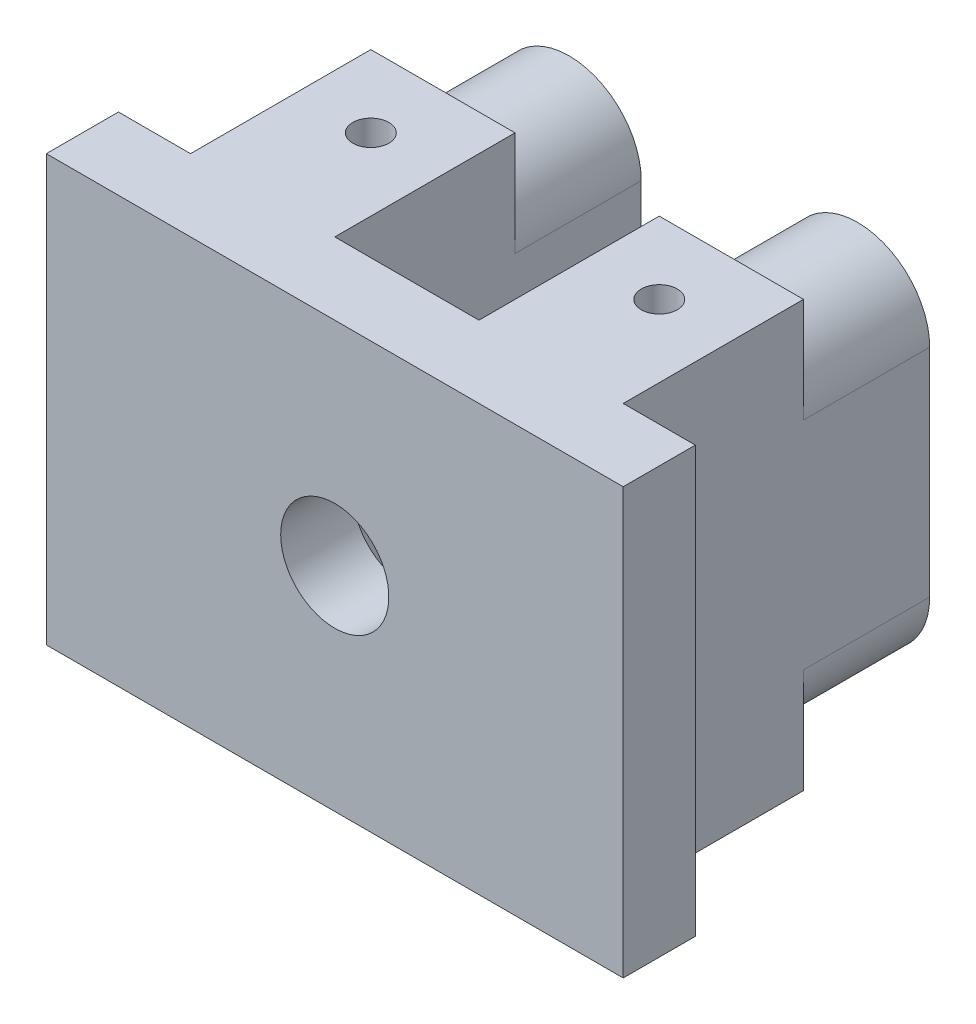
ISO-10303-21;
HEADER;
FILE_DESCRIPTION(('STEP AP214'),'2;1');
FILE_NAME('part.step','',(''),(''),'','','');
FILE_SCHEMA(('AUTOMOTIVE_DESIGN { 1 0 10303 214 1 1 1 1 }'));
ENDSEC;
DATA;
#1=APPLICATION_CONTEXT('core data for automotive mechanical design processes');
#2=APPLICATION_PROTOCOL_DEFINITION('international standard','automotive_design',2000,#1);
#3=PRODUCT_CONTEXT('',#1,'mechanical');
#4=PRODUCT('Part','Part','',(#3));
#5=PRODUCT_RELATED_PRODUCT_CATEGORY('part','',(#4));
#6=PRODUCT_DEFINITION_FORMATION('','',#4);
#7=PRODUCT_DEFINITION_CONTEXT('part definition',#1,'design');
#8=PRODUCT_DEFINITION('design','',#6,#7);
#9=PRODUCT_DEFINITION_SHAPE('','',#8);
#10=(LENGTH_UNIT() NAMED_UNIT(*) SI_UNIT(.MILLI.,.METRE.));
#11=(NAMED_UNIT(*) PLANE_ANGLE_UNIT() SI_UNIT($,.RADIAN.));
#12=(NAMED_UNIT(*) SI_UNIT($,.STERADIAN.) SOLID_ANGLE_UNIT());
#13=UNCERTAINTY_MEASURE_WITH_UNIT(LENGTH_MEASURE(1.E-05),#10,'distance_accuracy_value','');
#14=(GEOMETRIC_REPRESENTATION_CONTEXT(3) GLOBAL_UNCERTAINTY_ASSIGNED_CONTEXT((#13)) GLOBAL_UNIT_ASSIGNED_CONTEXT((#10,
#11,#12)) REPRESENTATION_CONTEXT('',''));
#15=CARTESIAN_POINT('',(0.,0.,0.));
#16=DIRECTION('',(0.,0.,1.));
#17=DIRECTION('',(1.,0.,0.));
#18=AXIS2_PLACEMENT_3D('',#15,#16,#17);
#19=CARTESIAN_POINT('',(6.,11.8,-7.));
#20=DIRECTION('',(0.,0.,1.));
#21=DIRECTION('',(1.,0.,0.));
#22=AXIS2_PLACEMENT_3D('',#19,#20,#21);
#23=PLANE('',#22);
#24=DIRECTION('',(0.,-1.,0.));
#25=VECTOR('',#24,1.);
#26=CARTESIAN_POINT('',(6.,11.8,-7.));
#27=LINE('',#26,#25);
#28=CARTESIAN_POINT('',(6.,11.8,-7.));
#29=VERTEX_POINT('',#28);
#30=CARTESIAN_POINT('',(6.,8.9,-7.));
#31=VERTEX_POINT('',#30);
#32=EDGE_CURVE('E316',#29,#31,#27,.T.);
#33=ORIENTED_EDGE('',*,*,#32,.T.);
#34=CARTESIAN_POINT('',(4.,8.9,-7.));
#35=DIRECTION('',(0.,0.,1.));
#36=DIRECTION('',(1.,0.,0.));
#37=AXIS2_PLACEMENT_3D('',#34,#35,#36);
#38=CIRCLE('',#37,2.);
#39=CARTESIAN_POINT('',(2.,8.9,-7.));
#40=VERTEX_POINT('',#39);
#41=EDGE_CURVE('E209',#31,#40,#38,.T.);
#42=ORIENTED_EDGE('',*,*,#41,.T.);
#43=DIRECTION('',(0.,-1.,0.));
#44=VECTOR('',#43,1.);
#45=CARTESIAN_POINT('',(2.,11.8,-7.));
#46=LINE('',#45,#44);
#47=CARTESIAN_POINT('',(2.,11.8,-7.));
#48=VERTEX_POINT('',#47);
#49=EDGE_CURVE('E174',#48,#40,#46,.T.);
#50=ORIENTED_EDGE('',*,*,#49,.F.);
#51=DIRECTION('',(-1.,0.,0.));
#52=VECTOR('',#51,1.);
#53=CARTESIAN_POINT('',(6.,11.8,-7.));
#54=LINE('',#53,#52);
#55=EDGE_CURVE('E246',#29,#48,#54,.T.);
#56=ORIENTED_EDGE('',*,*,#55,.F.);
#57=EDGE_LOOP('',(#33,#42,#50,#56));
#58=FACE_BOUND('',#57,.T.);
#59=ADVANCED_FACE('F32',(#58),#23,.F.);
#60=CARTESIAN_POINT('',(-2.,11.8,-7.));
#61=DIRECTION('',(0.,0.,1.));
#62=DIRECTION('',(1.,0.,0.));
#63=AXIS2_PLACEMENT_3D('',#60,#61,#62);
#64=PLANE('',#63);
#65=DIRECTION('',(0.,-1.,0.));
#66=VECTOR('',#65,1.);
#67=CARTESIAN_POINT('',(-2.,11.8,-7.));
#68=LINE('',#67,#66);
#69=CARTESIAN_POINT('',(-2.,11.8,-7.));
#70=VERTEX_POINT('',#69);
#71=CARTESIAN_POINT('',(-2.,8.9,-7.));
#72=VERTEX_POINT('',#71);
#73=EDGE_CURVE('E306',#70,#72,#68,.T.);
#74=ORIENTED_EDGE('',*,*,#73,.T.);
#75=CARTESIAN_POINT('',(-4.,8.9,-7.));
#76=DIRECTION('',(0.,0.,1.));
#77=DIRECTION('',(1.,0.,0.));
#78=AXIS2_PLACEMENT_3D('',#75,#76,#77);
#79=CIRCLE('',#78,2.);
#80=CARTESIAN_POINT('',(-6.,8.9,-7.));
#81=VERTEX_POINT('',#80);
#82=EDGE_CURVE('E233',#72,#81,#79,.T.);
#83=ORIENTED_EDGE('',*,*,#82,.T.);
#84=DIRECTION('',(0.,-1.,0.));
#85=VECTOR('',#84,1.);
#86=CARTESIAN_POINT('',(-6.,11.8,-7.));
#87=LINE('',#86,#85);
#88=CARTESIAN_POINT('',(-6.,11.8,-7.));
#89=VERTEX_POINT('',#88);
#90=EDGE_CURVE('E302',#89,#81,#87,.T.);
#91=ORIENTED_EDGE('',*,*,#90,.F.);
#92=DIRECTION('',(-1.,0.,0.));
#93=VECTOR('',#92,1.);
#94=CARTESIAN_POINT('',(-2.,11.8,-7.));
#95=LINE('',#94,#93);
#96=EDGE_CURVE('E254',#70,#89,#95,.T.);
#97=ORIENTED_EDGE('',*,*,#96,.F.);
#98=EDGE_LOOP('',(#74,#83,#91,#97));
#99=FACE_BOUND('',#98,.T.);
#100=ADVANCED_FACE('F387',(#99),#64,.F.);
#101=CARTESIAN_POINT('',(0.,11.8,0.));
#102=DIRECTION('',(0.,0.,-1.));
#103=DIRECTION('',(-1.,0.,0.));
#104=AXIS2_PLACEMENT_3D('',#101,#102,#103);
#105=PLANE('',#104);
#106=CARTESIAN_POINT('',(0.,5.9,0.));
#107=DIRECTION('',(0.,0.,-1.));
#108=DIRECTION('',(-1.,0.,0.));
#109=AXIS2_PLACEMENT_3D('',#106,#107,#108);
#110=CIRCLE('',#109,1.5);
#111=CARTESIAN_POINT('',(-1.5,5.9,0.));
#112=VERTEX_POINT('',#111);
#113=EDGE_CURVE('E434',#112,#112,#110,.T.);
#114=ORIENTED_EDGE('',*,*,#113,.T.);
#115=EDGE_LOOP('',(#114));
#116=FACE_BOUND('',#115,.T.);
#117=DIRECTION('',(1.,0.,0.));
#118=VECTOR('',#117,1.);
#119=CARTESIAN_POINT('',(0.,0.,0.));
#120=LINE('',#119,#118);
#121=CARTESIAN_POINT('',(-8.,0.,0.));
#122=VERTEX_POINT('',#121);
#123=CARTESIAN_POINT('',(8.,0.,0.));
#124=VERTEX_POINT('',#123);
#125=EDGE_CURVE('E236',#122,#124,#120,.T.);
#126=ORIENTED_EDGE('',*,*,#125,.T.);
#127=DIRECTION('',(0.,-1.,0.));
#128=VECTOR('',#127,1.);
#129=CARTESIAN_POINT('',(8.,11.8,0.));
#130=LINE('',#129,#128);
#131=CARTESIAN_POINT('',(8.,11.8,0.));
#132=VERTEX_POINT('',#131);
#133=EDGE_CURVE('E11',#132,#124,#130,.T.);
#134=ORIENTED_EDGE('',*,*,#133,.F.);
#135=DIRECTION('',(1.,0.,0.));
#136=VECTOR('',#135,1.);
#137=CARTESIAN_POINT('',(-8.,11.8,0.));
#138=LINE('',#137,#136);
#139=CARTESIAN_POINT('',(-8.,11.8,0.));
#140=VERTEX_POINT('',#139);
#141=EDGE_CURVE('E237',#140,#132,#138,.T.);
#142=ORIENTED_EDGE('',*,*,#141,.F.);
#143=DIRECTION('',(0.,-1.,0.));
#144=VECTOR('',#143,1.);
#145=CARTESIAN_POINT('',(-8.,11.8,0.));
#146=LINE('',#145,#144);
#147=EDGE_CURVE('E262',#140,#122,#146,.T.);
#148=ORIENTED_EDGE('',*,*,#147,.T.);
#149=EDGE_LOOP('',(#126,#134,#142,#148));
#150=FACE_BOUND('',#149,.T.);
#151=ADVANCED_FACE('F34',(#116,#150),#105,.F.);
#152=CARTESIAN_POINT('',(8.,11.8,0.));
#153=DIRECTION('',(-1.,0.,0.));
#154=DIRECTION('',(0.,0.,1.));
#155=AXIS2_PLACEMENT_3D('',#152,#153,#154);
#156=PLANE('',#155);
#157=DIRECTION('',(0.,0.,-1.));
#158=VECTOR('',#157,1.);
#159=CARTESIAN_POINT('',(8.,0.,0.));
#160=LINE('',#159,#158);
#161=CARTESIAN_POINT('',(8.,0.,-2.));
#162=VERTEX_POINT('',#161);
#163=EDGE_CURVE('E264',#124,#162,#160,.T.);
#164=ORIENTED_EDGE('',*,*,#163,.T.);
#165=DIRECTION('',(0.,-1.,0.));
#166=VECTOR('',#165,1.);
#167=CARTESIAN_POINT('',(8.,11.8,-2.));
#168=LINE('',#167,#166);
#169=CARTESIAN_POINT('',(8.,11.8,-2.));
#170=VERTEX_POINT('',#169);
#171=EDGE_CURVE('E41',#170,#162,#168,.T.);
#172=ORIENTED_EDGE('',*,*,#171,.F.);
#173=DIRECTION('',(0.,0.,-1.));
#174=VECTOR('',#173,1.);
#175=CARTESIAN_POINT('',(8.,11.8,0.));
#176=LINE('',#175,#174);
#177=EDGE_CURVE('E239',#132,#170,#176,.T.);
#178=ORIENTED_EDGE('',*,*,#177,.F.);
#179=ORIENTED_EDGE('',*,*,#133,.T.);
#180=EDGE_LOOP('',(#164,#172,#178,#179));
#181=FACE_BOUND('',#180,.T.);
#182=ADVANCED_FACE('F346',(#181),#156,.F.);
#183=CARTESIAN_POINT('',(8.,11.8,-2.));
#184=DIRECTION('',(0.,0.,1.));
#185=DIRECTION('',(1.,0.,0.));
#186=AXIS2_PLACEMENT_3D('',#183,#184,#185);
#187=PLANE('',#186);
#188=DIRECTION('',(-1.,0.,0.));
#189=VECTOR('',#188,1.);
#190=CARTESIAN_POINT('',(8.,0.,-2.));
#191=LINE('',#190,#189);
#192=CARTESIAN_POINT('',(6.,0.,-2.));
#193=VERTEX_POINT('',#192);
#194=EDGE_CURVE('E266',#162,#193,#191,.T.);
#195=ORIENTED_EDGE('',*,*,#194,.T.);
#196=DIRECTION('',(0.,-1.,0.));
#197=VECTOR('',#196,1.);
#198=CARTESIAN_POINT('',(6.,11.8,-2.));
#199=LINE('',#198,#197);
#200=CARTESIAN_POINT('',(6.,11.8,-2.));
#201=VERTEX_POINT('',#200);
#202=EDGE_CURVE('E319',#201,#193,#199,.T.);
#203=ORIENTED_EDGE('',*,*,#202,.F.);
#204=DIRECTION('',(-1.,0.,0.));
#205=VECTOR('',#204,1.);
#206=CARTESIAN_POINT('',(8.,11.8,-2.));
#207=LINE('',#206,#205);
#208=EDGE_CURVE('E242',#170,#201,#207,.T.);
#209=ORIENTED_EDGE('',*,*,#208,.F.);
#210=ORIENTED_EDGE('',*,*,#171,.T.);
#211=EDGE_LOOP('',(#195,#203,#209,#210));
#212=FACE_BOUND('',#211,.T.);
#213=ADVANCED_FACE('F326',(#212),#187,.F.);
#214=CARTESIAN_POINT('',(6.,11.8,-2.));
#215=DIRECTION('',(-1.,0.,0.));
#216=DIRECTION('',(0.,0.,1.));
#217=AXIS2_PLACEMENT_3D('',#214,#215,#216);
#218=PLANE('',#217);
#219=CARTESIAN_POINT('',(6.,2.9,-7.));
#220=VERTEX_POINT('',#219);
#221=CARTESIAN_POINT('',(6.,0.,-7.));
#222=VERTEX_POINT('',#221);
#223=EDGE_CURVE('E315',#220,#222,#27,.T.);
#224=ORIENTED_EDGE('',*,*,#223,.F.);
#225=DIRECTION('',(0.,0.,1.));
#226=VECTOR('',#225,1.);
#227=CARTESIAN_POINT('',(6.,2.9,-10.5));
#228=LINE('',#227,#226);
#229=CARTESIAN_POINT('',(6.,2.9,-10.5));
#230=VERTEX_POINT('',#229);
#231=EDGE_CURVE('E204',#230,#220,#228,.T.);
#232=ORIENTED_EDGE('',*,*,#231,.F.);
#233=DIRECTION('',(0.,1.,0.));
#234=VECTOR('',#233,1.);
#235=CARTESIAN_POINT('',(6.,8.9,-10.5));
#236=LINE('',#235,#234);
#237=CARTESIAN_POINT('',(6.,8.9,-10.5));
#238=VERTEX_POINT('',#237);
#239=EDGE_CURVE('E178',#230,#238,#236,.T.);
#240=ORIENTED_EDGE('',*,*,#239,.T.);
#241=DIRECTION('',(0.,0.,1.));
#242=VECTOR('',#241,1.);
#243=CARTESIAN_POINT('',(6.,8.9,-10.5));
#244=LINE('',#243,#242);
#245=EDGE_CURVE('E192',#238,#31,#244,.T.);
#246=ORIENTED_EDGE('',*,*,#245,.T.);
#247=ORIENTED_EDGE('',*,*,#32,.F.);
#248=DIRECTION('',(0.,0.,-1.));
#249=VECTOR('',#248,1.);
#250=CARTESIAN_POINT('',(6.,11.8,-2.));
#251=LINE('',#250,#249);
#252=EDGE_CURVE('E244',#201,#29,#251,.T.);
#253=ORIENTED_EDGE('',*,*,#252,.F.);
#254=ORIENTED_EDGE('',*,*,#202,.T.);
#255=DIRECTION('',(0.,0.,-1.));
#256=VECTOR('',#255,1.);
#257=CARTESIAN_POINT('',(6.,0.,-2.));
#258=LINE('',#257,#256);
#259=EDGE_CURVE('E269',#193,#222,#258,.T.);
#260=ORIENTED_EDGE('',*,*,#259,.T.);
#261=EDGE_LOOP('',(#224,#232,#240,#246,#247,#253,#254,#260));
#262=FACE_BOUND('',#261,.T.);
#263=ADVANCED_FACE('F338',(#262),#218,.F.);
#264=CARTESIAN_POINT('',(2.,2.9,-7.));
#265=VERTEX_POINT('',#264);
#266=CARTESIAN_POINT('',(2.,0.,-7.));
#267=VERTEX_POINT('',#266);
#268=EDGE_CURVE('E313',#265,#267,#46,.T.);
#269=ORIENTED_EDGE('',*,*,#268,.F.);
#270=CARTESIAN_POINT('',(4.,2.9,-7.));
#271=DIRECTION('',(0.,0.,1.));
#272=DIRECTION('',(1.,0.,0.));
#273=AXIS2_PLACEMENT_3D('',#270,#271,#272);
#274=CIRCLE('',#273,2.);
#275=EDGE_CURVE('E203',#265,#220,#274,.T.);
#276=ORIENTED_EDGE('',*,*,#275,.T.);
#277=ORIENTED_EDGE('',*,*,#223,.T.);
#278=DIRECTION('',(-1.,0.,0.));
#279=VECTOR('',#278,1.);
#280=CARTESIAN_POINT('',(6.,0.,-7.));
#281=LINE('',#280,#279);
#282=EDGE_CURVE('E272',#222,#267,#281,.T.);
#283=ORIENTED_EDGE('',*,*,#282,.T.);
#284=EDGE_LOOP('',(#269,#276,#277,#283));
#285=FACE_BOUND('',#284,.T.);
#286=ADVANCED_FACE('F379',(#285),#23,.F.);
#287=CARTESIAN_POINT('',(2.,11.8,-7.));
#288=DIRECTION('',(1.,0.,0.));
#289=DIRECTION('',(0.,0.,-1.));
#290=AXIS2_PLACEMENT_3D('',#287,#288,#289);
#291=PLANE('',#290);
#292=ORIENTED_EDGE('',*,*,#49,.T.);
#293=DIRECTION('',(0.,0.,1.));
#294=VECTOR('',#293,1.);
#295=CARTESIAN_POINT('',(2.,8.9,-10.5));
#296=LINE('',#295,#294);
#297=CARTESIAN_POINT('',(2.,8.9,-10.5));
#298=VERTEX_POINT('',#297);
#299=EDGE_CURVE('E168',#298,#40,#296,.T.);
#300=ORIENTED_EDGE('',*,*,#299,.F.);
#301=DIRECTION('',(0.,-1.,0.));
#302=VECTOR('',#301,1.);
#303=CARTESIAN_POINT('',(2.,8.9,-10.5));
#304=LINE('',#303,#302);
#305=CARTESIAN_POINT('',(2.,2.9,-10.5));
#306=VERTEX_POINT('',#305);
#307=EDGE_CURVE('E171',#298,#306,#304,.T.);
#308=ORIENTED_EDGE('',*,*,#307,.T.);
#309=DIRECTION('',(0.,0.,1.));
#310=VECTOR('',#309,1.);
#311=CARTESIAN_POINT('',(2.,2.9,-10.5));
#312=LINE('',#311,#310);
#313=EDGE_CURVE('E48',#306,#265,#312,.T.);
#314=ORIENTED_EDGE('',*,*,#313,.T.);
#315=ORIENTED_EDGE('',*,*,#268,.T.);
#316=DIRECTION('',(0.,0.,1.));
#317=VECTOR('',#316,1.);
#318=CARTESIAN_POINT('',(2.,0.,-7.));
#319=LINE('',#318,#317);
#320=CARTESIAN_POINT('',(2.,0.,-2.));
#321=VERTEX_POINT('',#320);
#322=EDGE_CURVE('E275',#267,#321,#319,.T.);
#323=ORIENTED_EDGE('',*,*,#322,.T.);
#324=DIRECTION('',(0.,-1.,0.));
#325=VECTOR('',#324,1.);
#326=CARTESIAN_POINT('',(2.,11.8,-2.));
#327=LINE('',#326,#325);
#328=CARTESIAN_POINT('',(2.,11.8,-2.));
#329=VERTEX_POINT('',#328);
#330=EDGE_CURVE('E311',#329,#321,#327,.T.);
#331=ORIENTED_EDGE('',*,*,#330,.F.);
#332=DIRECTION('',(0.,0.,1.));
#333=VECTOR('',#332,1.);
#334=CARTESIAN_POINT('',(2.,11.8,-7.));
#335=LINE('',#334,#333);
#336=EDGE_CURVE('E248',#48,#329,#335,.T.);
#337=ORIENTED_EDGE('',*,*,#336,.F.);
#338=EDGE_LOOP('',(#292,#300,#308,#314,#315,#323,#331,#337));
#339=FACE_BOUND('',#338,.T.);
#340=ADVANCED_FACE('F170',(#339),#291,.F.);
#341=CARTESIAN_POINT('',(2.,11.8,-2.));
#342=DIRECTION('',(0.,0.,1.));
#343=DIRECTION('',(1.,0.,0.));
#344=AXIS2_PLACEMENT_3D('',#341,#342,#343);
#345=PLANE('',#344);
#346=CARTESIAN_POINT('',(0.,5.9,-2.));
#347=DIRECTION('',(0.,0.,1.));
#348=DIRECTION('',(1.,0.,0.));
#349=AXIS2_PLACEMENT_3D('',#346,#347,#348);
#350=CIRCLE('',#349,1.5);
#351=CARTESIAN_POINT('',(1.5,5.9,-2.));
#352=VERTEX_POINT('',#351);
#353=EDGE_CURVE('E36',#352,#352,#350,.T.);
#354=ORIENTED_EDGE('',*,*,#353,.T.);
#355=EDGE_LOOP('',(#354));
#356=FACE_BOUND('',#355,.T.);
#357=DIRECTION('',(-1.,0.,0.));
#358=VECTOR('',#357,1.);
#359=CARTESIAN_POINT('',(2.,0.,-2.));
#360=LINE('',#359,#358);
#361=CARTESIAN_POINT('',(-2.,0.,-2.));
#362=VERTEX_POINT('',#361);
#363=EDGE_CURVE('E278',#321,#362,#360,.T.);
#364=ORIENTED_EDGE('',*,*,#363,.T.);
#365=DIRECTION('',(0.,-1.,0.));
#366=VECTOR('',#365,1.);
#367=CARTESIAN_POINT('',(-2.,11.8,-2.));
#368=LINE('',#367,#366);
#369=CARTESIAN_POINT('',(-2.,11.8,-2.));
#370=VERTEX_POINT('',#369);
#371=EDGE_CURVE('E309',#370,#362,#368,.T.);
#372=ORIENTED_EDGE('',*,*,#371,.F.);
#373=DIRECTION('',(-1.,0.,0.));
#374=VECTOR('',#373,1.);
#375=CARTESIAN_POINT('',(2.,11.8,-2.));
#376=LINE('',#375,#374);
#377=EDGE_CURVE('E250',#329,#370,#376,.T.);
#378=ORIENTED_EDGE('',*,*,#377,.F.);
#379=ORIENTED_EDGE('',*,*,#330,.T.);
#380=EDGE_LOOP('',(#364,#372,#378,#379));
#381=FACE_BOUND('',#380,.T.);
#382=ADVANCED_FACE('F374',(#356,#381),#345,.F.);
#383=CARTESIAN_POINT('',(-2.,11.8,-2.));
#384=DIRECTION('',(-1.,0.,0.));
#385=DIRECTION('',(0.,0.,1.));
#386=AXIS2_PLACEMENT_3D('',#383,#384,#385);
#387=PLANE('',#386);
#388=CARTESIAN_POINT('',(-2.,2.9,-7.));
#389=VERTEX_POINT('',#388);
#390=CARTESIAN_POINT('',(-2.,0.,-7.));
#391=VERTEX_POINT('',#390);
#392=EDGE_CURVE('E305',#389,#391,#68,.T.);
#393=ORIENTED_EDGE('',*,*,#392,.F.);
#394=DIRECTION('',(0.,0.,1.));
#395=VECTOR('',#394,1.);
#396=CARTESIAN_POINT('',(-2.,2.9,-10.5));
#397=LINE('',#396,#395);
#398=CARTESIAN_POINT('',(-2.,2.9,-10.5));
#399=VERTEX_POINT('',#398);
#400=EDGE_CURVE('E227',#399,#389,#397,.T.);
#401=ORIENTED_EDGE('',*,*,#400,.F.);
#402=DIRECTION('',(0.,1.,0.));
#403=VECTOR('',#402,1.);
#404=CARTESIAN_POINT('',(-2.,8.9,-10.5));
#405=LINE('',#404,#403);
#406=CARTESIAN_POINT('',(-2.,8.9,-10.5));
#407=VERTEX_POINT('',#406);
#408=EDGE_CURVE('E219',#399,#407,#405,.T.);
#409=ORIENTED_EDGE('',*,*,#408,.T.);
#410=DIRECTION('',(0.,0.,1.));
#411=VECTOR('',#410,1.);
#412=CARTESIAN_POINT('',(-2.,8.9,-10.5));
#413=LINE('',#412,#411);
#414=EDGE_CURVE('E223',#407,#72,#413,.T.);
#415=ORIENTED_EDGE('',*,*,#414,.T.);
#416=ORIENTED_EDGE('',*,*,#73,.F.);
#417=DIRECTION('',(0.,0.,-1.));
#418=VECTOR('',#417,1.);
#419=CARTESIAN_POINT('',(-2.,11.8,-2.));
#420=LINE('',#419,#418);
#421=EDGE_CURVE('E252',#370,#70,#420,.T.);
#422=ORIENTED_EDGE('',*,*,#421,.F.);
#423=ORIENTED_EDGE('',*,*,#371,.T.);
#424=DIRECTION('',(0.,0.,-1.));
#425=VECTOR('',#424,1.);
#426=CARTESIAN_POINT('',(-2.,0.,-2.));
#427=LINE('',#426,#425);
#428=EDGE_CURVE('E281',#362,#391,#427,.T.);
#429=ORIENTED_EDGE('',*,*,#428,.T.);
#430=EDGE_LOOP('',(#393,#401,#409,#415,#416,#422,#423,#429));
#431=FACE_BOUND('',#430,.T.);
#432=ADVANCED_FACE('F369',(#431),#387,.F.);
#433=CARTESIAN_POINT('',(-6.,2.9,-7.));
#434=VERTEX_POINT('',#433);
#435=CARTESIAN_POINT('',(-6.,0.,-7.));
#436=VERTEX_POINT('',#435);
#437=EDGE_CURVE('E301',#434,#436,#87,.T.);
#438=ORIENTED_EDGE('',*,*,#437,.F.);
#439=CARTESIAN_POINT('',(-4.,2.9,-7.));
#440=DIRECTION('',(0.,0.,1.));
#441=DIRECTION('',(1.,0.,0.));
#442=AXIS2_PLACEMENT_3D('',#439,#440,#441);
#443=CIRCLE('',#442,2.);
#444=EDGE_CURVE('E226',#434,#389,#443,.T.);
#445=ORIENTED_EDGE('',*,*,#444,.T.);
#446=ORIENTED_EDGE('',*,*,#392,.T.);
#447=DIRECTION('',(-1.,0.,0.));
#448=VECTOR('',#447,1.);
#449=CARTESIAN_POINT('',(-2.,0.,-7.));
#450=LINE('',#449,#448);
#451=EDGE_CURVE('E284',#391,#436,#450,.T.);
#452=ORIENTED_EDGE('',*,*,#451,.T.);
#453=EDGE_LOOP('',(#438,#445,#446,#452));
#454=FACE_BOUND('',#453,.T.);
#455=ADVANCED_FACE('F366',(#454),#64,.F.);
#456=CARTESIAN_POINT('',(-6.,11.8,-7.));
#457=DIRECTION('',(1.,0.,0.));
#458=DIRECTION('',(0.,0.,-1.));
#459=AXIS2_PLACEMENT_3D('',#456,#457,#458);
#460=PLANE('',#459);
#461=ORIENTED_EDGE('',*,*,#90,.T.);
#462=DIRECTION('',(0.,0.,1.));
#463=VECTOR('',#462,1.);
#464=CARTESIAN_POINT('',(-6.,8.9,-10.5));
#465=LINE('',#464,#463);
#466=CARTESIAN_POINT('',(-6.,8.9,-10.5));
#467=VERTEX_POINT('',#466);
#468=EDGE_CURVE('E222',#467,#81,#465,.T.);
#469=ORIENTED_EDGE('',*,*,#468,.F.);
#470=DIRECTION('',(0.,-1.,0.));
#471=VECTOR('',#470,1.);
#472=CARTESIAN_POINT('',(-6.,8.9,-10.5));
#473=LINE('',#472,#471);
#474=CARTESIAN_POINT('',(-6.,2.9,-10.5));
#475=VERTEX_POINT('',#474);
#476=EDGE_CURVE('E214',#467,#475,#473,.T.);
#477=ORIENTED_EDGE('',*,*,#476,.T.);
#478=DIRECTION('',(0.,0.,1.));
#479=VECTOR('',#478,1.);
#480=CARTESIAN_POINT('',(-6.,2.9,-10.5));
#481=LINE('',#480,#479);
#482=EDGE_CURVE('E56',#475,#434,#481,.T.);
#483=ORIENTED_EDGE('',*,*,#482,.T.);
#484=ORIENTED_EDGE('',*,*,#437,.T.);
#485=DIRECTION('',(0.,0.,1.));
#486=VECTOR('',#485,1.);
#487=CARTESIAN_POINT('',(-6.,0.,-7.));
#488=LINE('',#487,#486);
#489=CARTESIAN_POINT('',(-6.,0.,-2.));
#490=VERTEX_POINT('',#489);
#491=EDGE_CURVE('E287',#436,#490,#488,.T.);
#492=ORIENTED_EDGE('',*,*,#491,.T.);
#493=DIRECTION('',(0.,-1.,0.));
#494=VECTOR('',#493,1.);
#495=CARTESIAN_POINT('',(-6.,11.8,-2.));
#496=LINE('',#495,#494);
#497=CARTESIAN_POINT('',(-6.,11.8,-2.));
#498=VERTEX_POINT('',#497);
#499=EDGE_CURVE('E299',#498,#490,#496,.T.);
#500=ORIENTED_EDGE('',*,*,#499,.F.);
#501=DIRECTION('',(0.,0.,1.));
#502=VECTOR('',#501,1.);
#503=CARTESIAN_POINT('',(-6.,11.8,-7.));
#504=LINE('',#503,#502);
#505=EDGE_CURVE('E256',#89,#498,#504,.T.);
#506=ORIENTED_EDGE('',*,*,#505,.F.);
#507=EDGE_LOOP('',(#461,#469,#477,#483,#484,#492,#500,#506));
#508=FACE_BOUND('',#507,.T.);
#509=ADVANCED_FACE('F362',(#508),#460,.F.);
#510=CARTESIAN_POINT('',(-6.,11.8,-2.));
#511=DIRECTION('',(0.,0.,1.));
#512=DIRECTION('',(1.,0.,0.));
#513=AXIS2_PLACEMENT_3D('',#510,#511,#512);
#514=PLANE('',#513);
#515=DIRECTION('',(-1.,0.,0.));
#516=VECTOR('',#515,1.);
#517=CARTESIAN_POINT('',(-6.,0.,-2.));
#518=LINE('',#517,#516);
#519=CARTESIAN_POINT('',(-8.,0.,-2.));
#520=VERTEX_POINT('',#519);
#521=EDGE_CURVE('E290',#490,#520,#518,.T.);
#522=ORIENTED_EDGE('',*,*,#521,.T.);
#523=DIRECTION('',(0.,-1.,0.));
#524=VECTOR('',#523,1.);
#525=CARTESIAN_POINT('',(-8.,11.8,-2.));
#526=LINE('',#525,#524);
#527=CARTESIAN_POINT('',(-8.,11.8,-2.));
#528=VERTEX_POINT('',#527);
#529=EDGE_CURVE('E296',#528,#520,#526,.T.);
#530=ORIENTED_EDGE('',*,*,#529,.F.);
#531=DIRECTION('',(-1.,0.,0.));
#532=VECTOR('',#531,1.);
#533=CARTESIAN_POINT('',(-6.,11.8,-2.));
#534=LINE('',#533,#532);
#535=EDGE_CURVE('E258',#498,#528,#534,.T.);
#536=ORIENTED_EDGE('',*,*,#535,.F.);
#537=ORIENTED_EDGE('',*,*,#499,.T.);
#538=EDGE_LOOP('',(#522,#530,#536,#537));
#539=FACE_BOUND('',#538,.T.);
#540=ADVANCED_FACE('F357',(#539),#514,.F.);
#541=CARTESIAN_POINT('',(-8.,11.8,-2.));
#542=DIRECTION('',(1.,0.,0.));
#543=DIRECTION('',(0.,0.,-1.));
#544=AXIS2_PLACEMENT_3D('',#541,#542,#543);
#545=PLANE('',#544);
#546=DIRECTION('',(0.,0.,1.));
#547=VECTOR('',#546,1.);
#548=CARTESIAN_POINT('',(-8.,0.,-2.));
#549=LINE('',#548,#547);
#550=EDGE_CURVE('E240',#520,#122,#549,.T.);
#551=ORIENTED_EDGE('',*,*,#550,.T.);
#552=ORIENTED_EDGE('',*,*,#147,.F.);
#553=DIRECTION('',(0.,0.,1.));
#554=VECTOR('',#553,1.);
#555=CARTESIAN_POINT('',(-8.,11.8,-2.));
#556=LINE('',#555,#554);
#557=EDGE_CURVE('E260',#528,#140,#556,.T.);
#558=ORIENTED_EDGE('',*,*,#557,.F.);
#559=ORIENTED_EDGE('',*,*,#529,.T.);
#560=EDGE_LOOP('',(#551,#552,#558,#559));
#561=FACE_BOUND('',#560,.T.);
#562=ADVANCED_FACE('F352',(#561),#545,.F.);
#563=CARTESIAN_POINT('',(0.,11.8,0.));
#564=DIRECTION('',(0.,1.,0.));
#565=DIRECTION('',(0.,0.,1.));
#566=AXIS2_PLACEMENT_3D('',#563,#564,#565);
#567=PLANE('',#566);
#568=CARTESIAN_POINT('',(-4.,11.8,-5.));
#569=DIRECTION('',(0.,1.,0.));
#570=DIRECTION('',(0.,0.,1.));
#571=AXIS2_PLACEMENT_3D('',#568,#569,#570);
#572=CIRCLE('',#571,0.5);
#573=CARTESIAN_POINT('',(-4.,11.8,-4.5));
#574=VERTEX_POINT('',#573);
#575=EDGE_CURVE('E193',#574,#574,#572,.T.);
#576=ORIENTED_EDGE('',*,*,#575,.F.);
#577=EDGE_LOOP('',(#576));
#578=FACE_BOUND('',#577,.T.);
#579=CARTESIAN_POINT('',(4.,11.8,-5.));
#580=DIRECTION('',(0.,1.,0.));
#581=DIRECTION('',(0.,0.,1.));
#582=AXIS2_PLACEMENT_3D('',#579,#580,#581);
#583=CIRCLE('',#582,0.500000000000002);
#584=CARTESIAN_POINT('',(4.,11.8,-4.5));
#585=VERTEX_POINT('',#584);
#586=EDGE_CURVE('E196',#585,#585,#583,.T.);
#587=ORIENTED_EDGE('',*,*,#586,.F.);
#588=EDGE_LOOP('',(#587));
#589=FACE_BOUND('',#588,.T.);
#590=ORIENTED_EDGE('',*,*,#141,.T.);
#591=ORIENTED_EDGE('',*,*,#177,.T.);
#592=ORIENTED_EDGE('',*,*,#208,.T.);
#593=ORIENTED_EDGE('',*,*,#252,.T.);
#594=ORIENTED_EDGE('',*,*,#55,.T.);
#595=ORIENTED_EDGE('',*,*,#336,.T.);
#596=ORIENTED_EDGE('',*,*,#377,.T.);
#597=ORIENTED_EDGE('',*,*,#421,.T.);
#598=ORIENTED_EDGE('',*,*,#96,.T.);
#599=ORIENTED_EDGE('',*,*,#505,.T.);
#600=ORIENTED_EDGE('',*,*,#535,.T.);
#601=ORIENTED_EDGE('',*,*,#557,.T.);
#602=EDGE_LOOP('',(#590,#591,#592,#593,#594,#595,#596,#597,#598,#599,#600,#601));
#603=FACE_BOUND('',#602,.T.);
#604=ADVANCED_FACE('F343',(#578,#589,#603),#567,.T.);
#605=CARTESIAN_POINT('',(0.,0.,0.));
#606=DIRECTION('',(0.,1.,0.));
#607=DIRECTION('',(0.,0.,1.));
#608=AXIS2_PLACEMENT_3D('',#605,#606,#607);
#609=PLANE('',#608);
#610=CARTESIAN_POINT('',(-4.,0.,-5.));
#611=DIRECTION('',(0.,1.,0.));
#612=DIRECTION('',(0.,0.,1.));
#613=AXIS2_PLACEMENT_3D('',#610,#611,#612);
#614=CIRCLE('',#613,0.5);
#615=CARTESIAN_POINT('',(-4.,0.,-4.5));
#616=VERTEX_POINT('',#615);
#617=EDGE_CURVE('E464',#616,#616,#614,.T.);
#618=ORIENTED_EDGE('',*,*,#617,.T.);
#619=EDGE_LOOP('',(#618));
#620=FACE_BOUND('',#619,.T.);
#621=CARTESIAN_POINT('',(4.,0.,-5.));
#622=DIRECTION('',(0.,1.,0.));
#623=DIRECTION('',(0.,0.,1.));
#624=AXIS2_PLACEMENT_3D('',#621,#622,#623);
#625=CIRCLE('',#624,0.500000000000002);
#626=CARTESIAN_POINT('',(4.,0.,-4.5));
#627=VERTEX_POINT('',#626);
#628=EDGE_CURVE('E461',#627,#627,#625,.T.);
#629=ORIENTED_EDGE('',*,*,#628,.T.);
#630=EDGE_LOOP('',(#629));
#631=FACE_BOUND('',#630,.T.);
#632=ORIENTED_EDGE('',*,*,#125,.F.);
#633=ORIENTED_EDGE('',*,*,#550,.F.);
#634=ORIENTED_EDGE('',*,*,#521,.F.);
#635=ORIENTED_EDGE('',*,*,#491,.F.);
#636=ORIENTED_EDGE('',*,*,#451,.F.);
#637=ORIENTED_EDGE('',*,*,#428,.F.);
#638=ORIENTED_EDGE('',*,*,#363,.F.);
#639=ORIENTED_EDGE('',*,*,#322,.F.);
#640=ORIENTED_EDGE('',*,*,#282,.F.);
#641=ORIENTED_EDGE('',*,*,#259,.F.);
#642=ORIENTED_EDGE('',*,*,#194,.F.);
#643=ORIENTED_EDGE('',*,*,#163,.F.);
#644=EDGE_LOOP('',(#632,#633,#634,#635,#636,#637,#638,#639,#640,#641,#642,#643));
#645=FACE_BOUND('',#644,.T.);
#646=ADVANCED_FACE('F333',(#620,#631,#645),#609,.F.);
#647=CARTESIAN_POINT('',(-4.,8.9,-10.5));
#648=DIRECTION('',(0.,0.,1.));
#649=DIRECTION('',(1.,0.,0.));
#650=AXIS2_PLACEMENT_3D('',#647,#648,#649);
#651=CYLINDRICAL_SURFACE('',#650,2.);
#652=ORIENTED_EDGE('',*,*,#82,.F.);
#653=ORIENTED_EDGE('',*,*,#414,.F.);
#654=CARTESIAN_POINT('',(-4.,8.9,-10.5));
#655=DIRECTION('',(0.,0.,1.));
#656=DIRECTION('',(1.,0.,0.));
#657=AXIS2_PLACEMENT_3D('',#654,#655,#656);
#658=CIRCLE('',#657,2.);
#659=EDGE_CURVE('E211',#407,#467,#658,.T.);
#660=ORIENTED_EDGE('',*,*,#659,.T.);
#661=ORIENTED_EDGE('',*,*,#468,.T.);
#662=EDGE_LOOP('',(#652,#653,#660,#661));
#663=FACE_BOUND('',#662,.T.);
#664=ADVANCED_FACE('F395',(#663),#651,.T.);
#665=CARTESIAN_POINT('',(-4.,2.9,-10.5));
#666=DIRECTION('',(0.,0.,1.));
#667=DIRECTION('',(1.,0.,0.));
#668=AXIS2_PLACEMENT_3D('',#665,#666,#667);
#669=CYLINDRICAL_SURFACE('',#668,2.);
#670=ORIENTED_EDGE('',*,*,#444,.F.);
#671=ORIENTED_EDGE('',*,*,#482,.F.);
#672=CARTESIAN_POINT('',(-4.,2.9,-10.5));
#673=DIRECTION('',(0.,0.,1.));
#674=DIRECTION('',(1.,0.,0.));
#675=AXIS2_PLACEMENT_3D('',#672,#673,#674);
#676=CIRCLE('',#675,2.);
#677=EDGE_CURVE('E216',#475,#399,#676,.T.);
#678=ORIENTED_EDGE('',*,*,#677,.T.);
#679=ORIENTED_EDGE('',*,*,#400,.T.);
#680=EDGE_LOOP('',(#670,#671,#678,#679));
#681=FACE_BOUND('',#680,.T.);
#682=ADVANCED_FACE('F397',(#681),#669,.T.);
#683=CARTESIAN_POINT('',(-4.,8.9,-10.5));
#684=DIRECTION('',(0.,0.,1.));
#685=DIRECTION('',(1.,0.,0.));
#686=AXIS2_PLACEMENT_3D('',#683,#684,#685);
#687=PLANE('',#686);
#688=CARTESIAN_POINT('',(-4.,8.9,-10.5));
#689=DIRECTION('',(0.,0.,-1.));
#690=DIRECTION('',(-1.,0.,0.));
#691=AXIS2_PLACEMENT_3D('',#688,#689,#690);
#692=CIRCLE('',#691,1.1);
#693=CARTESIAN_POINT('',(-5.1,8.9,-10.5));
#694=VERTEX_POINT('',#693);
#695=EDGE_CURVE('E450',#694,#694,#692,.T.);
#696=ORIENTED_EDGE('',*,*,#695,.F.);
#697=EDGE_LOOP('',(#696));
#698=FACE_BOUND('',#697,.T.);
#699=CARTESIAN_POINT('',(-4.,2.9,-10.5));
#700=DIRECTION('',(0.,0.,-1.));
#701=DIRECTION('',(-1.,0.,0.));
#702=AXIS2_PLACEMENT_3D('',#699,#700,#701);
#703=CIRCLE('',#702,1.1);
#704=CARTESIAN_POINT('',(-5.1,2.9,-10.5));
#705=VERTEX_POINT('',#704);
#706=EDGE_CURVE('E449',#705,#705,#703,.T.);
#707=ORIENTED_EDGE('',*,*,#706,.F.);
#708=EDGE_LOOP('',(#707));
#709=FACE_BOUND('',#708,.T.);
#710=ORIENTED_EDGE('',*,*,#659,.F.);
#711=ORIENTED_EDGE('',*,*,#408,.F.);
#712=ORIENTED_EDGE('',*,*,#677,.F.);
#713=ORIENTED_EDGE('',*,*,#476,.F.);
#714=EDGE_LOOP('',(#710,#711,#712,#713));
#715=FACE_BOUND('',#714,.T.);
#716=ADVANCED_FACE('F393',(#698,#709,#715),#687,.F.);
#717=CARTESIAN_POINT('',(4.,8.9,-10.5));
#718=DIRECTION('',(0.,0.,1.));
#719=DIRECTION('',(1.,0.,0.));
#720=AXIS2_PLACEMENT_3D('',#717,#718,#719);
#721=CYLINDRICAL_SURFACE('',#720,2.);
#722=ORIENTED_EDGE('',*,*,#41,.F.);
#723=ORIENTED_EDGE('',*,*,#245,.F.);
#724=CARTESIAN_POINT('',(4.,8.9,-10.5));
#725=DIRECTION('',(0.,0.,1.));
#726=DIRECTION('',(1.,0.,0.));
#727=AXIS2_PLACEMENT_3D('',#724,#725,#726);
#728=CIRCLE('',#727,2.);
#729=EDGE_CURVE('E185',#238,#298,#728,.T.);
#730=ORIENTED_EDGE('',*,*,#729,.T.);
#731=ORIENTED_EDGE('',*,*,#299,.T.);
#732=EDGE_LOOP('',(#722,#723,#730,#731));
#733=FACE_BOUND('',#732,.T.);
#734=ADVANCED_FACE('F190',(#733),#721,.T.);
#735=CARTESIAN_POINT('',(4.,2.9,-10.5));
#736=DIRECTION('',(0.,0.,1.));
#737=DIRECTION('',(1.,0.,0.));
#738=AXIS2_PLACEMENT_3D('',#735,#736,#737);
#739=CYLINDRICAL_SURFACE('',#738,2.);
#740=ORIENTED_EDGE('',*,*,#275,.F.);
#741=ORIENTED_EDGE('',*,*,#313,.F.);
#742=CARTESIAN_POINT('',(4.,2.9,-10.5));
#743=DIRECTION('',(0.,0.,1.));
#744=DIRECTION('',(1.,0.,0.));
#745=AXIS2_PLACEMENT_3D('',#742,#743,#744);
#746=CIRCLE('',#745,2.);
#747=EDGE_CURVE('E188',#306,#230,#746,.T.);
#748=ORIENTED_EDGE('',*,*,#747,.T.);
#749=ORIENTED_EDGE('',*,*,#231,.T.);
#750=EDGE_LOOP('',(#740,#741,#748,#749));
#751=FACE_BOUND('',#750,.T.);
#752=ADVANCED_FACE('F381',(#751),#739,.T.);
#753=CARTESIAN_POINT('',(4.,8.9,-10.5));
#754=DIRECTION('',(0.,0.,1.));
#755=DIRECTION('',(1.,0.,0.));
#756=AXIS2_PLACEMENT_3D('',#753,#754,#755);
#757=PLANE('',#756);
#758=CARTESIAN_POINT('',(4.,2.9,-10.5));
#759=DIRECTION('',(0.,0.,-1.));
#760=DIRECTION('',(-1.,0.,0.));
#761=AXIS2_PLACEMENT_3D('',#758,#759,#760);
#762=CIRCLE('',#761,1.1);
#763=CARTESIAN_POINT('',(2.9,2.9,-10.5));
#764=VERTEX_POINT('',#763);
#765=EDGE_CURVE('E443',#764,#764,#762,.T.);
#766=ORIENTED_EDGE('',*,*,#765,.F.);
#767=EDGE_LOOP('',(#766));
#768=FACE_BOUND('',#767,.T.);
#769=CARTESIAN_POINT('',(4.,8.9,-10.5));
#770=DIRECTION('',(0.,0.,-1.));
#771=DIRECTION('',(-1.,0.,0.));
#772=AXIS2_PLACEMENT_3D('',#769,#770,#771);
#773=CIRCLE('',#772,1.1);
#774=CARTESIAN_POINT('',(2.9,8.9,-10.5));
#775=VERTEX_POINT('',#774);
#776=EDGE_CURVE('E438',#775,#775,#773,.T.);
#777=ORIENTED_EDGE('',*,*,#776,.F.);
#778=EDGE_LOOP('',(#777));
#779=FACE_BOUND('',#778,.T.);
#780=ORIENTED_EDGE('',*,*,#729,.F.);
#781=ORIENTED_EDGE('',*,*,#239,.F.);
#782=ORIENTED_EDGE('',*,*,#747,.F.);
#783=ORIENTED_EDGE('',*,*,#307,.F.);
#784=EDGE_LOOP('',(#780,#781,#782,#783));
#785=FACE_BOUND('',#784,.T.);
#786=ADVANCED_FACE('F183',(#768,#779,#785),#757,.F.);
#787=CARTESIAN_POINT('',(4.,0.,-5.));
#788=DIRECTION('',(0.,1.,0.));
#789=DIRECTION('',(0.,0.,1.));
#790=AXIS2_PLACEMENT_3D('',#787,#788,#789);
#791=CYLINDRICAL_SURFACE('',#790,0.500000000000002);
#792=ORIENTED_EDGE('',*,*,#586,.T.);
#793=EDGE_LOOP('',(#792));
#794=FACE_BOUND('',#793,.T.);
#795=ORIENTED_EDGE('',*,*,#628,.F.);
#796=EDGE_LOOP('',(#795));
#797=FACE_BOUND('',#796,.T.);
#798=ADVANCED_FACE('F471',(#794,#797),#791,.F.);
#799=CARTESIAN_POINT('',(-4.,0.,-5.));
#800=DIRECTION('',(0.,1.,0.));
#801=DIRECTION('',(0.,0.,1.));
#802=AXIS2_PLACEMENT_3D('',#799,#800,#801);
#803=CYLINDRICAL_SURFACE('',#802,0.5);
#804=ORIENTED_EDGE('',*,*,#575,.T.);
#805=EDGE_LOOP('',(#804));
#806=FACE_BOUND('',#805,.T.);
#807=ORIENTED_EDGE('',*,*,#617,.F.);
#808=EDGE_LOOP('',(#807));
#809=FACE_BOUND('',#808,.T.);
#810=ADVANCED_FACE('F513',(#806,#809),#803,.F.);
#811=CARTESIAN_POINT('',(4.,8.9,-9.5));
#812=DIRECTION('',(0.,0.,-1.));
#813=DIRECTION('',(-1.,0.,0.));
#814=AXIS2_PLACEMENT_3D('',#811,#812,#813);
#815=CYLINDRICAL_SURFACE('',#814,1.1);
#816=CARTESIAN_POINT('',(4.,8.9,-9.5));
#817=DIRECTION('',(0.,0.,-1.));
#818=DIRECTION('',(-1.,0.,0.));
#819=AXIS2_PLACEMENT_3D('',#816,#817,#818);
#820=CIRCLE('',#819,1.1);
#821=CARTESIAN_POINT('',(2.9,8.9,-9.5));
#822=VERTEX_POINT('',#821);
#823=EDGE_CURVE('E440',#822,#822,#820,.T.);
#824=ORIENTED_EDGE('',*,*,#823,.F.);
#825=EDGE_LOOP('',(#824));
#826=FACE_BOUND('',#825,.T.);
#827=ORIENTED_EDGE('',*,*,#776,.T.);
#828=EDGE_LOOP('',(#827));
#829=FACE_BOUND('',#828,.T.);
#830=ADVANCED_FACE('F510',(#826,#829),#815,.F.);
#831=CARTESIAN_POINT('',(4.,8.9,-9.5));
#832=DIRECTION('',(0.,0.,-1.));
#833=DIRECTION('',(-1.,0.,0.));
#834=AXIS2_PLACEMENT_3D('',#831,#832,#833);
#835=PLANE('',#834);
#836=ORIENTED_EDGE('',*,*,#823,.T.);
#837=EDGE_LOOP('',(#836));
#838=FACE_BOUND('',#837,.T.);
#839=ADVANCED_FACE('F506',(#838),#835,.T.);
#840=CARTESIAN_POINT('',(4.,2.9,-9.5));
#841=DIRECTION('',(0.,0.,-1.));
#842=DIRECTION('',(-1.,0.,0.));
#843=AXIS2_PLACEMENT_3D('',#840,#841,#842);
#844=CYLINDRICAL_SURFACE('',#843,1.1);
#845=CARTESIAN_POINT('',(4.,2.9,-9.5));
#846=DIRECTION('',(0.,0.,-1.));
#847=DIRECTION('',(-1.,0.,0.));
#848=AXIS2_PLACEMENT_3D('',#845,#846,#847);
#849=CIRCLE('',#848,1.1);
#850=CARTESIAN_POINT('',(2.9,2.9,-9.5));
#851=VERTEX_POINT('',#850);
#852=EDGE_CURVE('E453',#851,#851,#849,.T.);
#853=ORIENTED_EDGE('',*,*,#852,.F.);
#854=EDGE_LOOP('',(#853));
#855=FACE_BOUND('',#854,.T.);
#856=ORIENTED_EDGE('',*,*,#765,.T.);
#857=EDGE_LOOP('',(#856));
#858=FACE_BOUND('',#857,.T.);
#859=ADVANCED_FACE('F509',(#855,#858),#844,.F.);
#860=CARTESIAN_POINT('',(4.,2.9,-9.5));
#861=DIRECTION('',(0.,0.,-1.));
#862=DIRECTION('',(-1.,0.,0.));
#863=AXIS2_PLACEMENT_3D('',#860,#861,#862);
#864=PLANE('',#863);
#865=ORIENTED_EDGE('',*,*,#852,.T.);
#866=EDGE_LOOP('',(#865));
#867=FACE_BOUND('',#866,.T.);
#868=ADVANCED_FACE('F520',(#867),#864,.T.);
#869=CARTESIAN_POINT('',(-4.,2.9,-9.5));
#870=DIRECTION('',(0.,0.,-1.));
#871=DIRECTION('',(-1.,0.,0.));
#872=AXIS2_PLACEMENT_3D('',#869,#870,#871);
#873=CYLINDRICAL_SURFACE('',#872,1.1);
#874=CARTESIAN_POINT('',(-4.,2.9,-9.5));
#875=DIRECTION('',(0.,0.,-1.));
#876=DIRECTION('',(-1.,0.,0.));
#877=AXIS2_PLACEMENT_3D('',#874,#875,#876);
#878=CIRCLE('',#877,1.1);
#879=CARTESIAN_POINT('',(-5.1,2.9,-9.5));
#880=VERTEX_POINT('',#879);
#881=EDGE_CURVE('E458',#880,#880,#878,.T.);
#882=ORIENTED_EDGE('',*,*,#881,.F.);
#883=EDGE_LOOP('',(#882));
#884=FACE_BOUND('',#883,.T.);
#885=ORIENTED_EDGE('',*,*,#706,.T.);
#886=EDGE_LOOP('',(#885));
#887=FACE_BOUND('',#886,.T.);
#888=ADVANCED_FACE('F523',(#884,#887),#873,.F.);
#889=CARTESIAN_POINT('',(-4.,2.9,-9.5));
#890=DIRECTION('',(0.,0.,-1.));
#891=DIRECTION('',(-1.,0.,0.));
#892=AXIS2_PLACEMENT_3D('',#889,#890,#891);
#893=PLANE('',#892);
#894=ORIENTED_EDGE('',*,*,#881,.T.);
#895=EDGE_LOOP('',(#894));
#896=FACE_BOUND('',#895,.T.);
#897=ADVANCED_FACE('F518',(#896),#893,.T.);
#898=CARTESIAN_POINT('',(-4.,8.9,-9.5));
#899=DIRECTION('',(0.,0.,-1.));
#900=DIRECTION('',(-1.,0.,0.));
#901=AXIS2_PLACEMENT_3D('',#898,#899,#900);
#902=CYLINDRICAL_SURFACE('',#901,1.1);
#903=CARTESIAN_POINT('',(-4.,8.9,-9.5));
#904=DIRECTION('',(0.,0.,-1.));
#905=DIRECTION('',(-1.,0.,0.));
#906=AXIS2_PLACEMENT_3D('',#903,#904,#905);
#907=CIRCLE('',#906,1.1);
#908=CARTESIAN_POINT('',(-5.1,8.9,-9.5));
#909=VERTEX_POINT('',#908);
#910=EDGE_CURVE('E446',#909,#909,#907,.T.);
#911=ORIENTED_EDGE('',*,*,#910,.F.);
#912=EDGE_LOOP('',(#911));
#913=FACE_BOUND('',#912,.T.);
#914=ORIENTED_EDGE('',*,*,#695,.T.);
#915=EDGE_LOOP('',(#914));
#916=FACE_BOUND('',#915,.T.);
#917=ADVANCED_FACE('F502',(#913,#916),#902,.F.);
#918=CARTESIAN_POINT('',(-4.,8.9,-9.5));
#919=DIRECTION('',(0.,0.,-1.));
#920=DIRECTION('',(-1.,0.,0.));
#921=AXIS2_PLACEMENT_3D('',#918,#919,#920);
#922=PLANE('',#921);
#923=ORIENTED_EDGE('',*,*,#910,.T.);
#924=EDGE_LOOP('',(#923));
#925=FACE_BOUND('',#924,.T.);
#926=ADVANCED_FACE('F497',(#925),#922,.T.);
#927=CARTESIAN_POINT('',(0.,5.9,0.));
#928=DIRECTION('',(0.,0.,-1.));
#929=DIRECTION('',(-1.,0.,0.));
#930=AXIS2_PLACEMENT_3D('',#927,#928,#929);
#931=CYLINDRICAL_SURFACE('',#930,1.5);
#932=ORIENTED_EDGE('',*,*,#113,.F.);
#933=EDGE_LOOP('',(#932));
#934=FACE_BOUND('',#933,.T.);
#935=ORIENTED_EDGE('',*,*,#353,.F.);
#936=EDGE_LOOP('',(#935));
#937=FACE_BOUND('',#936,.T.);
#938=ADVANCED_FACE('F495',(#934,#937),#931,.F.);
#939=CLOSED_SHELL('',(#59,#100,#151,#182,#213,#263,#286,#340,#382,#432,#455,#509,#540,#562,#604,
#646,#664,#682,#716,#734,#752,#786,#798,#810,#830,#839,#859,#868,#888,#897,#917,#926,#938));
#940=MANIFOLD_SOLID_BREP('B2',#939);
#941=ADVANCED_BREP_SHAPE_REPRESENTATION('',(#18,#940),#14);
#942=SHAPE_DEFINITION_REPRESENTATION(#9,#941);
ENDSEC;
END-ISO-10303-21;
